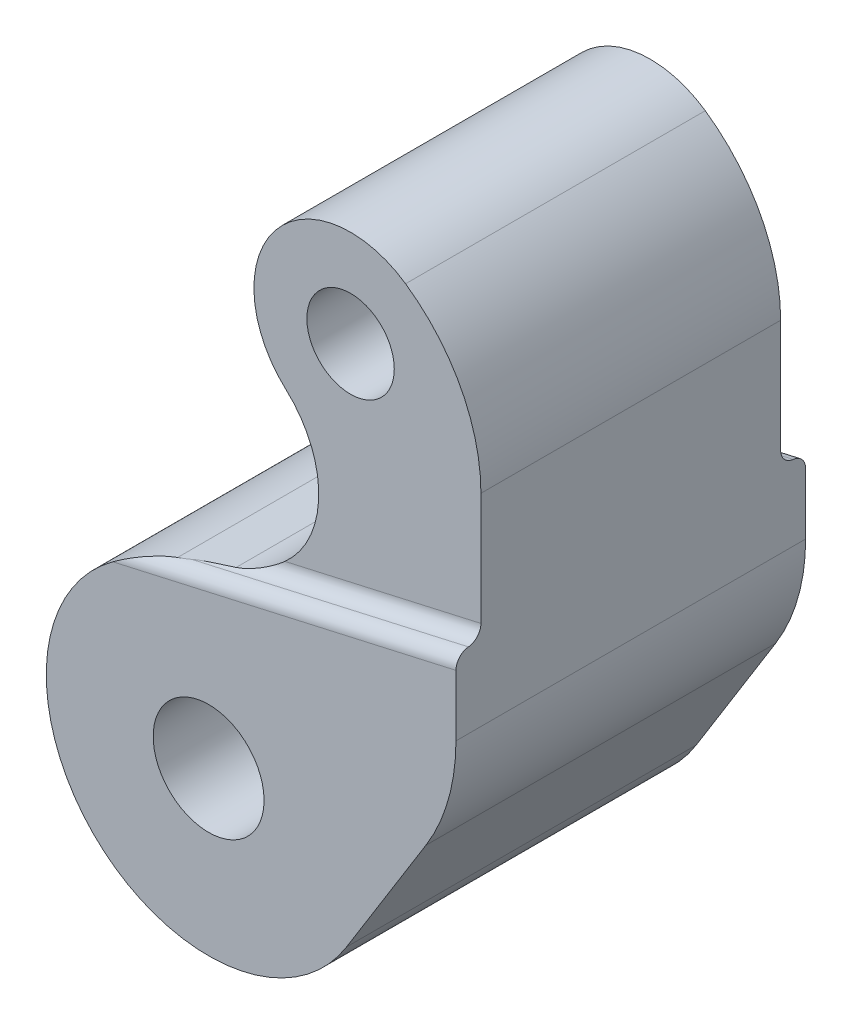
ISO-10303-21;
HEADER;
FILE_DESCRIPTION(('STEP AP214'),'2;1');
FILE_NAME('part.step','',(''),(''),'','','');
FILE_SCHEMA(('AUTOMOTIVE_DESIGN { 1 0 10303 214 1 1 1 1 }'));
ENDSEC;
DATA;
#1=APPLICATION_CONTEXT('core data for automotive mechanical design processes');
#2=APPLICATION_PROTOCOL_DEFINITION('international standard','automotive_design',2000,#1);
#3=PRODUCT_CONTEXT('',#1,'mechanical');
#4=PRODUCT('Part','Part','',(#3));
#5=PRODUCT_RELATED_PRODUCT_CATEGORY('part','',(#4));
#6=PRODUCT_DEFINITION_FORMATION('','',#4);
#7=PRODUCT_DEFINITION_CONTEXT('part definition',#1,'design');
#8=PRODUCT_DEFINITION('design','',#6,#7);
#9=PRODUCT_DEFINITION_SHAPE('','',#8);
#10=(LENGTH_UNIT() NAMED_UNIT(*) SI_UNIT(.MILLI.,.METRE.));
#11=(NAMED_UNIT(*) PLANE_ANGLE_UNIT() SI_UNIT($,.RADIAN.));
#12=(NAMED_UNIT(*) SI_UNIT($,.STERADIAN.) SOLID_ANGLE_UNIT());
#13=UNCERTAINTY_MEASURE_WITH_UNIT(LENGTH_MEASURE(1.E-05),#10,'distance_accuracy_value','');
#14=(GEOMETRIC_REPRESENTATION_CONTEXT(3) GLOBAL_UNCERTAINTY_ASSIGNED_CONTEXT((#13)) GLOBAL_UNIT_ASSIGNED_CONTEXT((#10,
#11,#12)) REPRESENTATION_CONTEXT('',''));
#15=CARTESIAN_POINT('',(0.,0.,0.));
#16=DIRECTION('',(0.,0.,1.));
#17=DIRECTION('',(1.,0.,0.));
#18=AXIS2_PLACEMENT_3D('',#15,#16,#17);
#19=CARTESIAN_POINT('',(-4.54564061344428,8.69992141573822,12.6614987080103));
#20=DIRECTION('',(0.,0.,-1.));
#21=DIRECTION('',(-1.,0.,0.));
#22=AXIS2_PLACEMENT_3D('',#19,#20,#21);
#23=CYLINDRICAL_SURFACE('',#22,7.27131782945737);
#24=CARTESIAN_POINT('',(-4.54564061344428,8.69992141573822,-10.8527131782946));
#25=DIRECTION('',(0.,0.,-1.));
#26=DIRECTION('',(-1.,0.,0.));
#27=AXIS2_PLACEMENT_3D('',#24,#25,#26);
#28=CIRCLE('',#27,7.27131782945737);
#29=CARTESIAN_POINT('',(0.276034989787939,3.25717327218245,-10.8527131782946));
#30=VERTEX_POINT('',#29);
#31=CARTESIAN_POINT('',(0.333314248452021,14.0913834097212,-10.8527131782946));
#32=VERTEX_POINT('',#31);
#33=EDGE_CURVE('E280',#30,#32,#28,.F.);
#34=ORIENTED_EDGE('',*,*,#33,.F.);
#35=CARTESIAN_POINT('',(0.276034989787939,3.25717327218244,-10.8527131782946));
#36=CARTESIAN_POINT('',(0.226197756540657,3.21302130105427,-10.8527225740718));
#37=CARTESIAN_POINT('',(0.175770096713166,3.16957148341845,-10.8542554738337));
#38=CARTESIAN_POINT('',(0.0738533211933617,3.0841620569401,-10.8599818743598));
#39=CARTESIAN_POINT('',(0.0223647207275001,3.04220175049952,-10.8641741118153));
#40=CARTESIAN_POINT('',(-0.133332996916682,2.91882195663878,-10.8801373464317));
#41=CARTESIAN_POINT('',(-0.239016846962875,2.83968869332019,-10.8952986792979));
#42=CARTESIAN_POINT('',(-0.452227146382972,2.68885980213852,-10.931989051614));
#43=CARTESIAN_POINT('',(-0.559708585616153,2.61707720826944,-10.9534281070478));
#44=CARTESIAN_POINT('',(-0.777686744900913,2.47969667993808,-11.000847883523));
#45=CARTESIAN_POINT('',(-0.88818582012181,2.41410376514411,-11.0268322427779));
#46=CARTESIAN_POINT('',(-1.1324798568544,2.27766278163929,-11.0865623083822));
#47=CARTESIAN_POINT('',(-1.26683132092128,2.20805636979421,-11.1208575227865));
#48=CARTESIAN_POINT('',(-1.53938355177362,2.077435817234,-11.1900976355895));
#49=CARTESIAN_POINT('',(-1.677581849714,2.01641631120586,-11.2250421127204));
#50=CARTESIAN_POINT('',(-1.88925878082263,1.93075515925382,-11.2749063533722));
#51=CARTESIAN_POINT('',(-1.96114754813575,1.9029792957367,-11.291223685254));
#52=CARTESIAN_POINT('',(-2.10609478092243,1.84961893985555,-11.3220540335709));
#53=CARTESIAN_POINT('',(-2.17915283890189,1.82403370298654,-11.3365676637741));
#54=CARTESIAN_POINT('',(-2.32669560149712,1.77500994580023,-11.3628354562837));
#55=CARTESIAN_POINT('',(-2.40118329497771,1.75157669489997,-11.3745829497607));
#56=CARTESIAN_POINT('',(-2.55143224926837,1.70697142277684,-11.394185309147));
#57=CARTESIAN_POINT('',(-2.62719499101294,1.68580227615033,-11.4020352715679));
#58=CARTESIAN_POINT('',(-2.70351003772547,1.66581749846585,-11.4073753938027));
#59=B_SPLINE_CURVE_WITH_KNOTS('',3,(#35,#36,#37,#38,#39,#40,#41,#42,#43,#44,#45,#46,#47,#48,#49,
#50,#51,#52,#53,#54,#55,#56,#57,#58),.UNSPECIFIED.,.F.,.F.,(4,2,2,2,2,2,2,2,2,2,2,4),(0.,
0.199684703433552,0.399274618342034,0.797485302502735,1.19024632381154,1.58332317489993,
2.04847354651292,2.5133319777018,2.74961641033204,2.98582021806512,3.22258778451387,
3.45965247845559),.UNSPECIFIED.);
#60=CARTESIAN_POINT('',(-2.70351003772547,1.66581749846585,-11.4073753938027));
#61=VERTEX_POINT('',#60);
#62=EDGE_CURVE('E259',#30,#61,#59,.T.);
#63=ORIENTED_EDGE('',*,*,#62,.T.);
#64=DIRECTION('',(0.,0.,-1.));
#65=VECTOR('',#64,1.);
#66=CARTESIAN_POINT('',(-2.70351003772547,1.66581749846585,12.6614987080103));
#67=LINE('',#66,#65);
#68=CARTESIAN_POINT('',(-2.70351003772547,1.66581749846585,11.4073753938027));
#69=VERTEX_POINT('',#68);
#70=EDGE_CURVE('E64',#69,#61,#67,.T.);
#71=ORIENTED_EDGE('',*,*,#70,.F.);
#72=CARTESIAN_POINT('',(-2.70351003772547,1.66581749846585,11.4073753938027));
#73=CARTESIAN_POINT('',(-2.63592242968063,1.68351656262205,11.4026485295914));
#74=CARTESIAN_POINT('',(-2.56876267366647,1.70214653002607,11.3959471369178));
#75=CARTESIAN_POINT('',(-2.43542600685049,1.74119507649496,11.3793839750118));
#76=CARTESIAN_POINT('',(-2.36924818874445,1.76161186633723,11.3695253415336));
#77=CARTESIAN_POINT('',(-2.17252765096522,1.82537511539845,11.336431939089));
#78=CARTESIAN_POINT('',(-2.04343843021408,1.87132901468455,11.3096462512518));
#79=CARTESIAN_POINT('',(-1.79065323920013,1.9693761892535,11.2523899044842));
#80=CARTESIAN_POINT('',(-1.66690765521051,2.02137690922647,11.2219746500155));
#81=CARTESIAN_POINT('',(-1.42247036146009,2.13213021155744,11.1605744278995));
#82=CARTESIAN_POINT('',(-1.30178156354126,2.19088895662435,11.1295889622446));
#83=CARTESIAN_POINT('',(-1.05414029262874,2.32007119570365,11.0672074853068));
#84=CARTESIAN_POINT('',(-0.927435576223543,2.39104745789854,11.0359686893666));
#85=CARTESIAN_POINT('',(-0.677779221821223,2.54095428624998,10.9783884309391));
#86=CARTESIAN_POINT('',(-0.554824113161502,2.61987718663533,10.9520423171909));
#87=CARTESIAN_POINT('',(-0.372490178520305,2.74488784241905,10.9180245258913));
#88=CARTESIAN_POINT('',(-0.311598392273848,2.78802331252216,10.9075429217016));
#89=CARTESIAN_POINT('',(-0.190945315629366,2.87632465345335,10.8889380736872));
#90=CARTESIAN_POINT('',(-0.131183830326188,2.92149016960749,10.8808144197352));
#91=CARTESIAN_POINT('',(-0.0127109783833322,3.01395000765302,10.867347744451));
#92=CARTESIAN_POINT('',(0.0459967574938729,3.06125023350267,10.8620130225598));
#93=CARTESIAN_POINT('',(0.162070032553974,3.15778858464575,10.8547031387053));
#94=CARTESIAN_POINT('',(0.219434683971381,3.20702793706182,10.8527301402378));
#95=CARTESIAN_POINT('',(0.276034989787784,3.25717327218223,10.8527131782935));
#96=B_SPLINE_CURVE_WITH_KNOTS('',3,(#72,#73,#74,#75,#76,#77,#78,#79,#80,#81,#82,#83,#84,#85,#86,
#87,#88,#89,#90,#91,#92,#93,#94,#95),.UNSPECIFIED.,.F.,.F.,(4,2,2,2,2,2,2,2,2,2,2,4),(0.,
0.209978327021744,0.419748748144656,0.838174921432808,1.25087879402629,1.66396204472108,
2.10933317055686,2.55427870938741,2.78028341463709,3.00624878642265,3.23288282336076,
3.45966265957713),.UNSPECIFIED.);
#97=CARTESIAN_POINT('',(0.27603498978794,3.25717327218245,10.8527131782946));
#98=VERTEX_POINT('',#97);
#99=EDGE_CURVE('E11',#69,#98,#96,.T.);
#100=ORIENTED_EDGE('',*,*,#99,.T.);
#101=CARTESIAN_POINT('',(-4.54564061344428,8.69992141573822,10.8527131782946));
#102=DIRECTION('',(0.,0.,1.));
#103=DIRECTION('',(1.,0.,0.));
#104=AXIS2_PLACEMENT_3D('',#101,#102,#103);
#105=CIRCLE('',#104,7.27131782945737);
#106=CARTESIAN_POINT('',(0.333314248452021,14.0913834097212,10.8527131782946));
#107=VERTEX_POINT('',#106);
#108=EDGE_CURVE('E313',#107,#98,#105,.F.);
#109=ORIENTED_EDGE('',*,*,#108,.F.);
#110=DIRECTION('',(0.,0.,-1.));
#111=VECTOR('',#110,1.);
#112=CARTESIAN_POINT('',(0.333314248452021,14.0913834097212,12.6614987080103));
#113=LINE('',#112,#111);
#114=EDGE_CURVE('E181',#107,#32,#113,.T.);
#115=ORIENTED_EDGE('',*,*,#114,.T.);
#116=EDGE_LOOP('',(#34,#63,#71,#100,#109,#115));
#117=FACE_BOUND('',#116,.T.);
#118=ADVANCED_FACE('F43',(#117),#23,.F.);
#119=CARTESIAN_POINT('',(1.80878552971576,14.6260364888678,12.6614987080103));
#120=DIRECTION('',(0.,0.,-1.));
#121=DIRECTION('',(-1.,0.,0.));
#122=AXIS2_PLACEMENT_3D('',#119,#120,#121);
#123=CYLINDRICAL_SURFACE('',#122,12.6614987080103);
#124=CARTESIAN_POINT('',(1.80878552971576,14.6260364888678,-10.8527131782946));
#125=DIRECTION('',(0.,0.,-1.));
#126=DIRECTION('',(-1.,0.,0.));
#127=AXIS2_PLACEMENT_3D('',#124,#125,#126);
#128=CIRCLE('',#127,12.6614987080103);
#129=CARTESIAN_POINT('',(9.01326833565485,25.0379996578324,-10.8527131782946));
#130=VERTEX_POINT('',#129);
#131=CARTESIAN_POINT('',(14.4702842377261,14.6260364888678,-10.8527131782946));
#132=VERTEX_POINT('',#131);
#133=EDGE_CURVE('E146',#130,#132,#128,.T.);
#134=ORIENTED_EDGE('',*,*,#133,.F.);
#135=DIRECTION('',(0.,0.,-1.));
#136=VECTOR('',#135,1.);
#137=CARTESIAN_POINT('',(9.01326833565485,25.0379996578324,12.6614987080103));
#138=LINE('',#137,#136);
#139=CARTESIAN_POINT('',(9.01326833565485,25.0379996578324,10.8527131782946));
#140=VERTEX_POINT('',#139);
#141=EDGE_CURVE('E174',#140,#130,#138,.T.);
#142=ORIENTED_EDGE('',*,*,#141,.F.);
#143=CARTESIAN_POINT('',(1.80878552971576,14.6260364888678,10.8527131782946));
#144=DIRECTION('',(0.,0.,1.));
#145=DIRECTION('',(1.,0.,0.));
#146=AXIS2_PLACEMENT_3D('',#143,#144,#145);
#147=CIRCLE('',#146,12.6614987080103);
#148=CARTESIAN_POINT('',(14.4702842377261,14.6260364888678,10.8527131782946));
#149=VERTEX_POINT('',#148);
#150=EDGE_CURVE('E171',#149,#140,#147,.T.);
#151=ORIENTED_EDGE('',*,*,#150,.F.);
#152=DIRECTION('',(0.,0.,-1.));
#153=VECTOR('',#152,1.);
#154=CARTESIAN_POINT('',(14.4702842377261,14.6260364888678,12.6614987080103));
#155=LINE('',#154,#153);
#156=EDGE_CURVE('E163',#149,#132,#155,.T.);
#157=ORIENTED_EDGE('',*,*,#156,.T.);
#158=EDGE_LOOP('',(#134,#142,#151,#157));
#159=FACE_BOUND('',#158,.T.);
#160=ADVANCED_FACE('F170',(#159),#123,.T.);
#161=CARTESIAN_POINT('',(5.03021855579995,19.2816714487048,12.6614987080103));
#162=DIRECTION('',(0.,0.,-1.));
#163=DIRECTION('',(-1.,0.,0.));
#164=AXIS2_PLACEMENT_3D('',#161,#162,#163);
#165=CYLINDRICAL_SURFACE('',#164,7.);
#166=CARTESIAN_POINT('',(5.03021855579995,19.2816714487048,-10.8527131782946));
#167=DIRECTION('',(0.,0.,-1.));
#168=DIRECTION('',(-1.,0.,0.));
#169=AXIS2_PLACEMENT_3D('',#166,#167,#168);
#170=CIRCLE('',#169,7.);
#171=EDGE_CURVE('E152',#32,#130,#170,.T.);
#172=ORIENTED_EDGE('',*,*,#171,.F.);
#173=ORIENTED_EDGE('',*,*,#114,.F.);
#174=CARTESIAN_POINT('',(5.03021855579995,19.2816714487048,10.8527131782946));
#175=DIRECTION('',(0.,0.,1.));
#176=DIRECTION('',(1.,0.,0.));
#177=AXIS2_PLACEMENT_3D('',#174,#175,#176);
#178=CIRCLE('',#177,7.);
#179=EDGE_CURVE('E200',#140,#107,#178,.T.);
#180=ORIENTED_EDGE('',*,*,#179,.F.);
#181=ORIENTED_EDGE('',*,*,#141,.T.);
#182=EDGE_LOOP('',(#172,#173,#180,#181));
#183=FACE_BOUND('',#182,.T.);
#184=ADVANCED_FACE('F276',(#183),#165,.T.);
#185=CARTESIAN_POINT('',(5.03021855579995,19.2816714487048,12.6614987080103));
#186=DIRECTION('',(0.,0.,-1.));
#187=DIRECTION('',(-1.,0.,0.));
#188=AXIS2_PLACEMENT_3D('',#185,#186,#187);
#189=CYLINDRICAL_SURFACE('',#188,3.16537467700258);
#190=CARTESIAN_POINT('',(5.03021855579995,19.2816714487048,10.8527131782946));
#191=DIRECTION('',(0.,0.,1.));
#192=DIRECTION('',(1.,0.,0.));
#193=AXIS2_PLACEMENT_3D('',#190,#191,#192);
#194=CIRCLE('',#193,3.16537467700258);
#195=CARTESIAN_POINT('',(8.19559323280254,19.2816714487048,10.8527131782946));
#196=VERTEX_POINT('',#195);
#197=EDGE_CURVE('E197',#196,#196,#194,.T.);
#198=ORIENTED_EDGE('',*,*,#197,.T.);
#199=EDGE_LOOP('',(#198));
#200=FACE_BOUND('',#199,.T.);
#201=CARTESIAN_POINT('',(5.03021855579995,19.2816714487048,-10.8527131782946));
#202=DIRECTION('',(0.,0.,-1.));
#203=DIRECTION('',(-1.,0.,0.));
#204=AXIS2_PLACEMENT_3D('',#201,#202,#203);
#205=CIRCLE('',#204,3.16537467700258);
#206=CARTESIAN_POINT('',(1.86484387879737,19.2816714487048,-10.8527131782946));
#207=VERTEX_POINT('',#206);
#208=EDGE_CURVE('E201',#207,#207,#205,.T.);
#209=ORIENTED_EDGE('',*,*,#208,.T.);
#210=EDGE_LOOP('',(#209));
#211=FACE_BOUND('',#210,.T.);
#212=ADVANCED_FACE('F399',(#200,#211),#189,.F.);
#213=CARTESIAN_POINT('',(-4.54564061344428,8.69992141573822,-12.6614987080103));
#214=DIRECTION('',(0.,0.,-1.));
#215=DIRECTION('',(-1.,0.,0.));
#216=AXIS2_PLACEMENT_3D('',#213,#214,#215);
#217=PLANE('',#216);
#218=CARTESIAN_POINT('',(-3.44154411200398,-10.6810585532448,-12.6614987080103));
#219=DIRECTION('',(0.,0.,1.));
#220=DIRECTION('',(1.,0.,0.));
#221=AXIS2_PLACEMENT_3D('',#218,#219,#220);
#222=CIRCLE('',#221,4.01550387596899);
#223=CARTESIAN_POINT('',(0.573959763965013,-10.6810585532448,-12.6614987080103));
#224=VERTEX_POINT('',#223);
#225=EDGE_CURVE('E317',#224,#224,#222,.T.);
#226=ORIENTED_EDGE('',*,*,#225,.T.);
#227=EDGE_LOOP('',(#226));
#228=FACE_BOUND('',#227,.T.);
#229=CARTESIAN_POINT('',(-3.44154411200398,-10.6810585532448,-12.6614987080103));
#230=DIRECTION('',(0.,0.,1.));
#231=DIRECTION('',(-1.,0.,0.));
#232=AXIS2_PLACEMENT_3D('',#229,#230,#231);
#233=CIRCLE('',#232,11.7571059431525);
#234=CARTESIAN_POINT('',(-10.3852191101125,-1.19343937459135,-12.6614987080103));
#235=VERTEX_POINT('',#234);
#236=CARTESIAN_POINT('',(6.54522573441048,-16.8854093003623,-12.6614987080103));
#237=VERTEX_POINT('',#236);
#238=EDGE_CURVE('E330',#235,#237,#233,.T.);
#239=ORIENTED_EDGE('',*,*,#238,.F.);
#240=DIRECTION('',(-0.975398118163345,-0.220450699893208,0.));
#241=VECTOR('',#240,1.);
#242=CARTESIAN_POINT('',(-2.70209378593431,0.543031430039292,-12.6614987080103));
#243=LINE('',#242,#241);
#244=CARTESIAN_POINT('',(14.4702842377261,4.42417768575999,-12.6614987080103));
#245=VERTEX_POINT('',#244);
#246=EDGE_CURVE('E167',#235,#245,#243,.F.);
#247=ORIENTED_EDGE('',*,*,#246,.T.);
#248=DIRECTION('',(0.,1.,0.));
#249=VECTOR('',#248,1.);
#250=CARTESIAN_POINT('',(14.4702842377261,14.6260364888678,-12.6614987080103));
#251=LINE('',#250,#249);
#252=CARTESIAN_POINT('',(14.4702842377261,0.,-12.6614987080103));
#253=VERTEX_POINT('',#252);
#254=EDGE_CURVE('E336',#253,#245,#251,.T.);
#255=ORIENTED_EDGE('',*,*,#254,.F.);
#256=CARTESIAN_POINT('',(0.,0.,-12.6614987080103));
#257=DIRECTION('',(0.,0.,1.));
#258=DIRECTION('',(-1.,0.,0.));
#259=AXIS2_PLACEMENT_3D('',#256,#257,#258);
#260=CIRCLE('',#259,14.4702842377261);
#261=CARTESIAN_POINT('',(12.2914090417409,-7.63612399645234,-12.6614987080103));
#262=VERTEX_POINT('',#261);
#263=EDGE_CURVE('E351',#262,#253,#260,.T.);
#264=ORIENTED_EDGE('',*,*,#263,.F.);
#265=DIRECTION('',(0.527710711897689,0.849424160563163,0.));
#266=VECTOR('',#265,1.);
#267=CARTESIAN_POINT('',(12.2914090417409,-7.63612399645234,-12.6614987080103));
#268=LINE('',#267,#266);
#269=EDGE_CURVE('E348',#237,#262,#268,.T.);
#270=ORIENTED_EDGE('',*,*,#269,.F.);
#271=EDGE_LOOP('',(#239,#247,#255,#264,#270));
#272=FACE_BOUND('',#271,.T.);
#273=ADVANCED_FACE('F232',(#228,#272),#217,.T.);
#274=CARTESIAN_POINT('',(-3.44154411200398,-10.6810585532448,12.6614987080103));
#275=DIRECTION('',(0.,0.,-1.));
#276=DIRECTION('',(-1.,0.,0.));
#277=AXIS2_PLACEMENT_3D('',#274,#275,#276);
#278=CYLINDRICAL_SURFACE('',#277,11.7571059431525);
#279=CARTESIAN_POINT('',(-3.44154411200398,-10.6810585532448,12.6614987080103));
#280=DIRECTION('',(0.,0.,1.));
#281=DIRECTION('',(-1.,0.,0.));
#282=AXIS2_PLACEMENT_3D('',#279,#280,#281);
#283=CIRCLE('',#282,11.7571059431525);
#284=CARTESIAN_POINT('',(-10.3852191101125,-1.19343937459134,12.6614987080103));
#285=VERTEX_POINT('',#284);
#286=CARTESIAN_POINT('',(6.54522573441048,-16.8854093003623,12.6614987080103));
#287=VERTEX_POINT('',#286);
#288=EDGE_CURVE('E332',#285,#287,#283,.T.);
#289=ORIENTED_EDGE('',*,*,#288,.F.);
#290=CARTESIAN_POINT('',(-10.3852191101125,-1.19343937459134,12.6614987080103));
#291=CARTESIAN_POINT('',(-10.3166598949197,-1.14326146710009,12.6614847749503));
#292=CARTESIAN_POINT('',(-10.247568678724,-1.09383869961419,12.6597827625886));
#293=CARTESIAN_POINT('',(-10.1084458129975,-0.996578470818206,12.6534086051483));
#294=CARTESIAN_POINT('',(-10.0384144853916,-0.948740485352421,12.6487374526225));
#295=CARTESIAN_POINT('',(-9.89758374890607,-0.854754458448012,12.6368384939342));
#296=CARTESIAN_POINT('',(-9.82678549921876,-0.808604231497822,12.6296141334022));
#297=CARTESIAN_POINT('',(-9.68439643575144,-0.717953647649506,12.612930102506));
#298=CARTESIAN_POINT('',(-9.61280554850725,-0.673453445371661,12.6034702232654));
#299=CARTESIAN_POINT('',(-9.39839926604306,-0.543348041841552,12.5723847011991));
#300=CARTESIAN_POINT('',(-9.25450768844662,-0.460176542132678,12.5479189210443));
#301=CARTESIAN_POINT('',(-8.96416078362173,-0.300416807929864,12.4932065477367));
#302=CARTESIAN_POINT('',(-8.81770446871588,-0.223831179874685,12.4629576809833));
#303=CARTESIAN_POINT('',(-8.49096957316831,-0.0616031412596894,12.3913084576695));
#304=CARTESIAN_POINT('',(-8.31013864388605,0.0224877990692826,12.3489056341842));
#305=CARTESIAN_POINT('',(-8.03646402726481,0.141424704082741,12.2826286355989));
#306=CARTESIAN_POINT('',(-7.9448336971918,0.179870704527532,12.2600906482696));
#307=CARTESIAN_POINT('',(-7.76072813955563,0.254390786965875,12.2145093605655));
#308=CARTESIAN_POINT('',(-7.66825286391446,0.290464733018437,12.1914660313306));
#309=CARTESIAN_POINT('',(-7.48129202244054,0.360683624042867,12.1450825614643));
#310=CARTESIAN_POINT('',(-7.38679568807272,0.394799746872605,12.1217422218732));
#311=CARTESIAN_POINT('',(-7.19682203595746,0.460643905037106,12.0757834586961));
#312=CARTESIAN_POINT('',(-7.10134491318356,0.492372404958253,12.053164895162));
#313=CARTESIAN_POINT('',(-6.9091628243356,0.553501289071226,12.009819064418));
#314=CARTESIAN_POINT('',(-6.81245739948963,0.582900771819114,11.9890925290477));
#315=CARTESIAN_POINT('',(-6.6662653659735,0.625279834390655,11.9610577631409));
#316=CARTESIAN_POINT('',(-6.61732743776595,0.639124285766603,11.9522193171236));
#317=CARTESIAN_POINT('',(-6.51903589574784,0.666239964051769,11.9359983475976));
#318=CARTESIAN_POINT('',(-6.46968213885629,0.679510983148491,11.9286163485075));
#319=CARTESIAN_POINT('',(-6.42011345085267,0.692492556772731,11.9221828687085));
#320=B_SPLINE_CURVE_WITH_KNOTS('',3,(#290,#291,#292,#293,#294,#295,#296,#297,#298,#299,#300,
#301,#302,#303,#304,#305,#306,#307,#308,#309,#310,#311,#312,#313,#314,#315,#316,#317,#318,#319),
.UNSPECIFIED.,.F.,.F.,(4,2,2,2,2,2,2,2,2,2,2,2,2,2,4),(0.,0.254834052351754,0.509582961097411,
0.763989383168987,1.01841958518073,1.52207329771144,2.0259254286745,2.63722519157759,
2.94288003812732,3.24855238633027,3.55794512924498,3.86727751365969,4.17672904579742,
4.33156912641717,4.48646485851569),.UNSPECIFIED.);
#321=CARTESIAN_POINT('',(-6.4201134508528,0.692492556772695,11.9221828687078));
#322=VERTEX_POINT('',#321);
#323=EDGE_CURVE('E239',#285,#322,#320,.T.);
#324=ORIENTED_EDGE('',*,*,#323,.T.);
#325=DIRECTION('',(0.,0.,-1.));
#326=VECTOR('',#325,1.);
#327=CARTESIAN_POINT('',(-6.4201134508528,0.692492556772695,12.6614987080103));
#328=LINE('',#327,#326);
#329=CARTESIAN_POINT('',(-6.4201134508528,0.692492556772695,-11.9221828687078));
#330=VERTEX_POINT('',#329);
#331=EDGE_CURVE('E192',#322,#330,#328,.T.);
#332=ORIENTED_EDGE('',*,*,#331,.T.);
#333=CARTESIAN_POINT('',(-6.4201134508528,0.692492556772695,-11.9221828687078));
#334=CARTESIAN_POINT('',(-6.50127151433609,0.671235537942043,-11.9328153663907));
#335=CARTESIAN_POINT('',(-6.5818423763933,0.64920971448834,-11.9458248243824));
#336=CARTESIAN_POINT('',(-6.74190884634964,0.603624444717038,-11.9750591788867));
#337=CARTESIAN_POINT('',(-6.82140516012265,0.580066070831361,-11.9912818428096));
#338=CARTESIAN_POINT('',(-6.97946042478931,0.531412819624307,-12.0254072752013));
#339=CARTESIAN_POINT('',(-7.05802017553858,0.506319385353367,-12.0433084739314));
#340=CARTESIAN_POINT('',(-7.21442425877334,0.454546629407415,-12.0799950183317));
#341=CARTESIAN_POINT('',(-7.29226845735738,0.427867017615897,-12.0987805256129));
#342=CARTESIAN_POINT('',(-7.44659290956178,0.373160723812202,-12.136503545577));
#343=CARTESIAN_POINT('',(-7.52307912062816,0.345148747994731,-12.1554380549062));
#344=CARTESIAN_POINT('',(-7.67545498582983,0.287540814603772,-12.1932683688435));
#345=CARTESIAN_POINT('',(-7.75134467937358,0.257944962693827,-12.2121641759464));
#346=CARTESIAN_POINT('',(-7.9782332236084,0.166732929038489,-12.2683935514038));
#347=CARTESIAN_POINT('',(-8.12839210334381,0.102713334165439,-12.3052540710078));
#348=CARTESIAN_POINT('',(-8.4596761077988,-0.0467808240858296,-12.3839249763824));
#349=CARTESIAN_POINT('',(-8.64025359661806,-0.133858997641649,-12.4250106604148));
#350=CARTESIAN_POINT('',(-8.99781013675463,-0.31776642501198,-12.5001514478885));
#351=CARTESIAN_POINT('',(-9.17479105971646,-0.414590442375728,-12.5342102971684));
#352=CARTESIAN_POINT('',(-9.43828903134303,-0.567746520315984,-12.5779666473571));
#353=CARTESIAN_POINT('',(-9.52630847825874,-0.620454997264351,-12.5913873948896));
#354=CARTESIAN_POINT('',(-9.70122552698329,-0.728346067431774,-12.6151895689186));
#355=CARTESIAN_POINT('',(-9.78812329105279,-0.783528297517056,-12.6255714398323));
#356=CARTESIAN_POINT('',(-9.96086512320618,-0.896445304088087,-12.642777712002));
#357=CARTESIAN_POINT('',(-10.0467067366022,-0.954184964446548,-12.6495949575493));
#358=CARTESIAN_POINT('',(-10.217034428516,-1.07205131066682,-12.6589419854695));
#359=CARTESIAN_POINT('',(-10.3015197639808,-1.13217924624778,-12.6614694920675));
#360=CARTESIAN_POINT('',(-10.3852191101124,-1.19343937459122,-12.6614987080112));
#361=B_SPLINE_CURVE_WITH_KNOTS('',3,(#333,#334,#335,#336,#337,#338,#339,#340,#341,#342,#343,
#344,#345,#346,#347,#348,#349,#350,#351,#352,#353,#354,#355,#356,#357,#358,#359,#360),
.UNSPECIFIED.,.F.,.F.,(4,2,2,2,2,2,2,2,2,2,2,2,2,4),(0.,0.253561640086451,0.506947715409634,
0.760099147607667,1.01329702524534,1.26415791082495,1.51500208178439,2.01688472846346,
2.6304897448316,3.24376681294351,3.55410652727944,3.86440083362862,4.17531566323129,
4.48639538660291),.UNSPECIFIED.);
#362=EDGE_CURVE('E213',#330,#235,#361,.T.);
#363=ORIENTED_EDGE('',*,*,#362,.T.);
#364=ORIENTED_EDGE('',*,*,#238,.T.);
#365=DIRECTION('',(0.,0.,-1.));
#366=VECTOR('',#365,1.);
#367=CARTESIAN_POINT('',(6.54522573441048,-16.8854093003623,12.6614987080103));
#368=LINE('',#367,#366);
#369=EDGE_CURVE('E188',#287,#237,#368,.T.);
#370=ORIENTED_EDGE('',*,*,#369,.F.);
#371=EDGE_LOOP('',(#289,#324,#332,#363,#364,#370));
#372=FACE_BOUND('',#371,.T.);
#373=ADVANCED_FACE('F227',(#372),#278,.T.);
#374=CARTESIAN_POINT('',(14.4702842377261,14.6260364888678,12.6614987080103));
#375=DIRECTION('',(-1.,0.,0.));
#376=DIRECTION('',(0.,-1.,0.));
#377=AXIS2_PLACEMENT_3D('',#374,#375,#376);
#378=PLANE('',#377);
#379=DIRECTION('',(0.,1.,0.));
#380=VECTOR('',#379,1.);
#381=CARTESIAN_POINT('',(14.4702842377261,14.6260364888678,10.8527131782946));
#382=LINE('',#381,#380);
#383=CARTESIAN_POINT('',(14.4702842377261,6.46522967796955,10.8527131782946));
#384=VERTEX_POINT('',#383);
#385=EDGE_CURVE('E318',#384,#149,#382,.T.);
#386=ORIENTED_EDGE('',*,*,#385,.F.);
#387=CARTESIAN_POINT('',(14.4702842377261,6.46522967796955,11.8527131782946));
#388=DIRECTION('',(-1.,0.,0.));
#389=DIRECTION('',(0.,1.,0.));
#390=AXIS2_PLACEMENT_3D('',#387,#388,#389);
#391=ELLIPSE('',#390,1.0252224003497,1.);
#392=CARTESIAN_POINT('',(14.4702842377261,5.44470368186477,11.7571059431525));
#393=VERTEX_POINT('',#392);
#394=EDGE_CURVE('E302',#384,#393,#391,.T.);
#395=ORIENTED_EDGE('',*,*,#394,.T.);
#396=CARTESIAN_POINT('',(14.4702842377261,4.42417768575999,11.6614987080103));
#397=DIRECTION('',(-1.,0.,0.));
#398=DIRECTION('',(0.,1.,0.));
#399=AXIS2_PLACEMENT_3D('',#396,#397,#398);
#400=ELLIPSE('',#399,1.0252224003497,1.);
#401=CARTESIAN_POINT('',(14.4702842377261,4.42417768575999,12.6614987080103));
#402=VERTEX_POINT('',#401);
#403=EDGE_CURVE('E222',#393,#402,#400,.F.);
#404=ORIENTED_EDGE('',*,*,#403,.T.);
#405=DIRECTION('',(0.,1.,0.));
#406=VECTOR('',#405,1.);
#407=CARTESIAN_POINT('',(14.4702842377261,14.6260364888678,12.6614987080103));
#408=LINE('',#407,#406);
#409=CARTESIAN_POINT('',(14.4702842377261,0.,12.6614987080103));
#410=VERTEX_POINT('',#409);
#411=EDGE_CURVE('E342',#410,#402,#408,.T.);
#412=ORIENTED_EDGE('',*,*,#411,.F.);
#413=DIRECTION('',(0.,0.,-1.));
#414=VECTOR('',#413,1.);
#415=CARTESIAN_POINT('',(14.4702842377261,0.,12.6614987080103));
#416=LINE('',#415,#414);
#417=EDGE_CURVE('E173',#410,#253,#416,.T.);
#418=ORIENTED_EDGE('',*,*,#417,.T.);
#419=ORIENTED_EDGE('',*,*,#254,.T.);
#420=CARTESIAN_POINT('',(14.4702842377261,4.42417768575999,-11.6614987080103));
#421=DIRECTION('',(-1.,0.,0.));
#422=DIRECTION('',(0.,-1.,0.));
#423=AXIS2_PLACEMENT_3D('',#420,#421,#422);
#424=ELLIPSE('',#423,1.0252224003497,1.);
#425=CARTESIAN_POINT('',(14.4702842377261,5.44470368186477,-11.7571059431525));
#426=VERTEX_POINT('',#425);
#427=EDGE_CURVE('E206',#245,#426,#424,.F.);
#428=ORIENTED_EDGE('',*,*,#427,.T.);
#429=CARTESIAN_POINT('',(14.4702842377261,6.46522967796955,-11.8527131782946));
#430=DIRECTION('',(-1.,0.,0.));
#431=DIRECTION('',(0.,-1.,0.));
#432=AXIS2_PLACEMENT_3D('',#429,#430,#431);
#433=ELLIPSE('',#432,1.0252224003497,1.);
#434=CARTESIAN_POINT('',(14.4702842377261,6.46522967796955,-10.8527131782946));
#435=VERTEX_POINT('',#434);
#436=EDGE_CURVE('E165',#426,#435,#433,.T.);
#437=ORIENTED_EDGE('',*,*,#436,.T.);
#438=DIRECTION('',(0.,-1.,0.));
#439=VECTOR('',#438,1.);
#440=CARTESIAN_POINT('',(14.4702842377261,14.6260364888678,-10.8527131782946));
#441=LINE('',#440,#439);
#442=EDGE_CURVE('E149',#132,#435,#441,.T.);
#443=ORIENTED_EDGE('',*,*,#442,.F.);
#444=ORIENTED_EDGE('',*,*,#156,.F.);
#445=EDGE_LOOP('',(#386,#395,#404,#412,#418,#419,#428,#437,#443,#444));
#446=FACE_BOUND('',#445,.T.);
#447=ADVANCED_FACE('F162',(#446),#378,.F.);
#448=CARTESIAN_POINT('',(-4.54564061344428,8.69992141573822,12.6614987080103));
#449=DIRECTION('',(0.,0.,-1.));
#450=DIRECTION('',(-1.,0.,0.));
#451=AXIS2_PLACEMENT_3D('',#448,#449,#450);
#452=PLANE('',#451);
#453=ORIENTED_EDGE('',*,*,#411,.T.);
#454=DIRECTION('',(0.975398118163345,0.220450699893208,0.));
#455=VECTOR('',#454,1.);
#456=CARTESIAN_POINT('',(-2.70209378593431,0.543031430039293,12.6614987080103));
#457=LINE('',#456,#455);
#458=EDGE_CURVE('E248',#402,#285,#457,.F.);
#459=ORIENTED_EDGE('',*,*,#458,.T.);
#460=ORIENTED_EDGE('',*,*,#288,.T.);
#461=DIRECTION('',(0.527710711897689,0.849424160563163,0.));
#462=VECTOR('',#461,1.);
#463=CARTESIAN_POINT('',(12.2914090417409,-7.63612399645234,12.6614987080103));
#464=LINE('',#463,#462);
#465=CARTESIAN_POINT('',(12.2914090417409,-7.63612399645234,12.6614987080103));
#466=VERTEX_POINT('',#465);
#467=EDGE_CURVE('E335',#287,#466,#464,.T.);
#468=ORIENTED_EDGE('',*,*,#467,.T.);
#469=CARTESIAN_POINT('',(0.,0.,12.6614987080103));
#470=DIRECTION('',(0.,0.,1.));
#471=DIRECTION('',(-1.,0.,0.));
#472=AXIS2_PLACEMENT_3D('',#469,#470,#471);
#473=CIRCLE('',#472,14.4702842377261);
#474=EDGE_CURVE('E339',#466,#410,#473,.T.);
#475=ORIENTED_EDGE('',*,*,#474,.T.);
#476=EDGE_LOOP('',(#453,#459,#460,#468,#475));
#477=FACE_BOUND('',#476,.T.);
#478=CARTESIAN_POINT('',(-3.44154411200398,-10.6810585532448,12.6614987080103));
#479=DIRECTION('',(0.,0.,1.));
#480=DIRECTION('',(1.,0.,0.));
#481=AXIS2_PLACEMENT_3D('',#478,#479,#480);
#482=CIRCLE('',#481,4.01550387596899);
#483=CARTESIAN_POINT('',(0.573959763965013,-10.6810585532448,12.6614987080103));
#484=VERTEX_POINT('',#483);
#485=EDGE_CURVE('E323',#484,#484,#482,.T.);
#486=ORIENTED_EDGE('',*,*,#485,.F.);
#487=EDGE_LOOP('',(#486));
#488=FACE_BOUND('',#487,.T.);
#489=ADVANCED_FACE('F375',(#477,#488),#452,.F.);
#490=CARTESIAN_POINT('',(-6.4201134508528,0.692492556772695,12.6614987080103));
#491=DIRECTION('',(0.25334205145813,-0.967376764742149,0.));
#492=DIRECTION('',(0.967376764742149,0.25334205145813,0.));
#493=AXIS2_PLACEMENT_3D('',#490,#491,#492);
#494=PLANE('',#493);
#495=ORIENTED_EDGE('',*,*,#331,.F.);
#496=CARTESIAN_POINT('',(-34.0099440030486,-6.53288697086,11.6614987080103));
#497=DIRECTION('',(0.25334205145813,-0.967376764742149,0.));
#498=DIRECTION('',(0.967376764742149,0.25334205145813,0.));
#499=AXIS2_PLACEMENT_3D('',#496,#497,#498);
#500=ELLIPSE('',#499,29.5416825997123,1.);
#501=CARTESIAN_POINT('',(-5.56291830512106,0.916979628030308,11.7571059431525));
#502=VERTEX_POINT('',#501);
#503=EDGE_CURVE('E247',#322,#502,#500,.F.);
#504=ORIENTED_EDGE('',*,*,#503,.T.);
#505=CARTESIAN_POINT('',(22.8841073928065,8.36684622692062,11.8527131782946));
#506=DIRECTION('',(0.25334205145813,-0.967376764742149,0.));
#507=DIRECTION('',(0.967376764742149,0.25334205145813,0.));
#508=AXIS2_PLACEMENT_3D('',#505,#506,#507);
#509=ELLIPSE('',#508,29.5416825997123,1.);
#510=EDGE_CURVE('E59',#502,#69,#509,.T.);
#511=ORIENTED_EDGE('',*,*,#510,.T.);
#512=ORIENTED_EDGE('',*,*,#70,.T.);
#513=CARTESIAN_POINT('',(22.8841073928065,8.36684622692061,-11.8527131782946));
#514=DIRECTION('',(0.25334205145813,-0.967376764742149,0.));
#515=DIRECTION('',(-0.967376764742149,-0.25334205145813,0.));
#516=AXIS2_PLACEMENT_3D('',#513,#514,#515);
#517=ELLIPSE('',#516,29.5416825997123,1.);
#518=CARTESIAN_POINT('',(-5.56291830512106,0.916979628030304,-11.7571059431525));
#519=VERTEX_POINT('',#518);
#520=EDGE_CURVE('E267',#61,#519,#517,.T.);
#521=ORIENTED_EDGE('',*,*,#520,.T.);
#522=CARTESIAN_POINT('',(-34.0099440030486,-6.53288697086001,-11.6614987080103));
#523=DIRECTION('',(0.25334205145813,-0.967376764742149,0.));
#524=DIRECTION('',(-0.967376764742149,-0.25334205145813,0.));
#525=AXIS2_PLACEMENT_3D('',#522,#523,#524);
#526=ELLIPSE('',#525,29.5416825997123,1.);
#527=EDGE_CURVE('E209',#519,#330,#526,.F.);
#528=ORIENTED_EDGE('',*,*,#527,.T.);
#529=EDGE_LOOP('',(#495,#504,#511,#512,#521,#528));
#530=FACE_BOUND('',#529,.T.);
#531=ADVANCED_FACE('F236',(#530),#494,.F.);
#532=CARTESIAN_POINT('',(12.2914090417409,-7.63612399645234,12.6614987080103));
#533=DIRECTION('',(-0.849424160563163,0.527710711897689,0.));
#534=DIRECTION('',(-0.527710711897689,-0.849424160563163,0.));
#535=AXIS2_PLACEMENT_3D('',#532,#533,#534);
#536=PLANE('',#535);
#537=ORIENTED_EDGE('',*,*,#269,.T.);
#538=DIRECTION('',(0.,0.,-1.));
#539=VECTOR('',#538,1.);
#540=CARTESIAN_POINT('',(12.2914090417409,-7.63612399645234,12.6614987080103));
#541=LINE('',#540,#539);
#542=EDGE_CURVE('E179',#466,#262,#541,.T.);
#543=ORIENTED_EDGE('',*,*,#542,.F.);
#544=ORIENTED_EDGE('',*,*,#467,.F.);
#545=ORIENTED_EDGE('',*,*,#369,.T.);
#546=EDGE_LOOP('',(#537,#543,#544,#545));
#547=FACE_BOUND('',#546,.T.);
#548=ADVANCED_FACE('F234',(#547),#536,.F.);
#549=CARTESIAN_POINT('',(0.,0.,12.6614987080103));
#550=DIRECTION('',(0.,0.,-1.));
#551=DIRECTION('',(-1.,0.,0.));
#552=AXIS2_PLACEMENT_3D('',#549,#550,#551);
#553=CYLINDRICAL_SURFACE('',#552,14.4702842377261);
#554=ORIENTED_EDGE('',*,*,#263,.T.);
#555=ORIENTED_EDGE('',*,*,#417,.F.);
#556=ORIENTED_EDGE('',*,*,#474,.F.);
#557=ORIENTED_EDGE('',*,*,#542,.T.);
#558=EDGE_LOOP('',(#554,#555,#556,#557));
#559=FACE_BOUND('',#558,.T.);
#560=ADVANCED_FACE('F385',(#559),#553,.T.);
#561=CARTESIAN_POINT('',(-3.44154411200398,-10.6810585532448,12.6614987080103));
#562=DIRECTION('',(0.,0.,-1.));
#563=DIRECTION('',(-1.,0.,0.));
#564=AXIS2_PLACEMENT_3D('',#561,#562,#563);
#565=CYLINDRICAL_SURFACE('',#564,4.01550387596899);
#566=ORIENTED_EDGE('',*,*,#485,.T.);
#567=EDGE_LOOP('',(#566));
#568=FACE_BOUND('',#567,.T.);
#569=ORIENTED_EDGE('',*,*,#225,.F.);
#570=EDGE_LOOP('',(#569));
#571=FACE_BOUND('',#570,.T.);
#572=ADVANCED_FACE('F387',(#568,#571),#565,.F.);
#573=CARTESIAN_POINT('',(1.80878552971576,14.6260364888678,10.8527131782946));
#574=DIRECTION('',(0.,0.,1.));
#575=DIRECTION('',(1.,0.,0.));
#576=AXIS2_PLACEMENT_3D('',#573,#574,#575);
#577=PLANE('',#576);
#578=ORIENTED_EDGE('',*,*,#197,.F.);
#579=EDGE_LOOP('',(#578));
#580=FACE_BOUND('',#579,.T.);
#581=ORIENTED_EDGE('',*,*,#108,.T.);
#582=DIRECTION('',(-0.975398118163345,-0.220450699893208,0.));
#583=VECTOR('',#582,1.);
#584=CARTESIAN_POINT('',(14.2370963373374,6.41252664841673,10.8527131782946));
#585=LINE('',#584,#583);
#586=EDGE_CURVE('E294',#98,#384,#585,.F.);
#587=ORIENTED_EDGE('',*,*,#586,.T.);
#588=ORIENTED_EDGE('',*,*,#385,.T.);
#589=ORIENTED_EDGE('',*,*,#150,.T.);
#590=ORIENTED_EDGE('',*,*,#179,.T.);
#591=EDGE_LOOP('',(#581,#587,#588,#589,#590));
#592=FACE_BOUND('',#591,.T.);
#593=ADVANCED_FACE('F314',(#580,#592),#577,.T.);
#594=CARTESIAN_POINT('',(1.80878552971576,14.6260364888678,-10.8527131782946));
#595=DIRECTION('',(0.,0.,-1.));
#596=DIRECTION('',(1.,0.,0.));
#597=AXIS2_PLACEMENT_3D('',#594,#595,#596);
#598=PLANE('',#597);
#599=ORIENTED_EDGE('',*,*,#208,.F.);
#600=EDGE_LOOP('',(#599));
#601=FACE_BOUND('',#600,.T.);
#602=ORIENTED_EDGE('',*,*,#442,.T.);
#603=DIRECTION('',(0.975398118163345,0.220450699893208,0.));
#604=VECTOR('',#603,1.);
#605=CARTESIAN_POINT('',(-7.19248414671142,1.56920582571319,-10.8527131782946));
#606=LINE('',#605,#604);
#607=EDGE_CURVE('E287',#435,#30,#606,.F.);
#608=ORIENTED_EDGE('',*,*,#607,.T.);
#609=ORIENTED_EDGE('',*,*,#33,.T.);
#610=ORIENTED_EDGE('',*,*,#171,.T.);
#611=ORIENTED_EDGE('',*,*,#133,.T.);
#612=EDGE_LOOP('',(#602,#608,#609,#610,#611));
#613=FACE_BOUND('',#612,.T.);
#614=ADVANCED_FACE('F148',(#601,#613),#598,.T.);
#615=CARTESIAN_POINT('',(-2.70209378593431,0.543031430039293,-11.6614987080103));
#616=DIRECTION('',(-0.975398118163345,-0.220450699893208,0.));
#617=DIRECTION('',(0.220450699893208,-0.975398118163345,0.));
#618=AXIS2_PLACEMENT_3D('',#615,#616,#617);
#619=CYLINDRICAL_SURFACE('',#618,1.);
#620=ORIENTED_EDGE('',*,*,#527,.F.);
#621=DIRECTION('',(-0.975398118163345,-0.220450699893208,0.));
#622=VECTOR('',#621,1.);
#623=CARTESIAN_POINT('',(-2.92153463118289,1.51396138221147,-11.7571059431525));
#624=LINE('',#623,#622);
#625=EDGE_CURVE('E290',#519,#426,#624,.F.);
#626=ORIENTED_EDGE('',*,*,#625,.T.);
#627=ORIENTED_EDGE('',*,*,#427,.F.);
#628=ORIENTED_EDGE('',*,*,#246,.F.);
#629=ORIENTED_EDGE('',*,*,#362,.F.);
#630=EDGE_LOOP('',(#620,#626,#627,#628,#629));
#631=FACE_BOUND('',#630,.T.);
#632=ADVANCED_FACE('F224',(#631),#619,.T.);
#633=CARTESIAN_POINT('',(-2.58201831982311,0.570169805694623,11.6614987080103));
#634=DIRECTION('',(0.975398118163345,0.220450699893208,0.));
#635=DIRECTION('',(-0.220450699893208,0.975398118163345,0.));
#636=AXIS2_PLACEMENT_3D('',#633,#634,#635);
#637=CYLINDRICAL_SURFACE('',#636,1.);
#638=ORIENTED_EDGE('',*,*,#403,.F.);
#639=DIRECTION('',(0.975398118163345,0.220450699893208,0.));
#640=VECTOR('',#639,1.);
#641=CARTESIAN_POINT('',(-2.80145916507169,1.5410997578668,11.7571059431525));
#642=LINE('',#641,#640);
#643=EDGE_CURVE('E297',#393,#502,#642,.F.);
#644=ORIENTED_EDGE('',*,*,#643,.T.);
#645=ORIENTED_EDGE('',*,*,#503,.F.);
#646=ORIENTED_EDGE('',*,*,#323,.F.);
#647=ORIENTED_EDGE('',*,*,#458,.F.);
#648=EDGE_LOOP('',(#638,#644,#645,#646,#647));
#649=FACE_BOUND('',#648,.T.);
#650=ADVANCED_FACE('F250',(#649),#637,.T.);
#651=CARTESIAN_POINT('',(-3.14097547643147,2.48489133438365,-11.8527131782946));
#652=DIRECTION('',(-0.975398118163345,-0.220450699893208,0.));
#653=DIRECTION('',(0.220450699893208,-0.975398118163345,0.));
#654=AXIS2_PLACEMENT_3D('',#651,#652,#653);
#655=CYLINDRICAL_SURFACE('',#654,1.);
#656=ORIENTED_EDGE('',*,*,#62,.F.);
#657=ORIENTED_EDGE('',*,*,#607,.F.);
#658=ORIENTED_EDGE('',*,*,#436,.F.);
#659=ORIENTED_EDGE('',*,*,#625,.F.);
#660=ORIENTED_EDGE('',*,*,#520,.F.);
#661=EDGE_LOOP('',(#656,#657,#658,#659,#660));
#662=FACE_BOUND('',#661,.T.);
#663=ADVANCED_FACE('F253',(#662),#655,.F.);
#664=CARTESIAN_POINT('',(-3.02090001032026,2.51202971003898,11.8527131782946));
#665=DIRECTION('',(0.975398118163345,0.220450699893208,0.));
#666=DIRECTION('',(-0.220450699893208,0.975398118163345,0.));
#667=AXIS2_PLACEMENT_3D('',#664,#665,#666);
#668=CYLINDRICAL_SURFACE('',#667,1.);
#669=ORIENTED_EDGE('',*,*,#510,.F.);
#670=ORIENTED_EDGE('',*,*,#643,.F.);
#671=ORIENTED_EDGE('',*,*,#394,.F.);
#672=ORIENTED_EDGE('',*,*,#586,.F.);
#673=ORIENTED_EDGE('',*,*,#99,.F.);
#674=EDGE_LOOP('',(#669,#670,#671,#672,#673));
#675=FACE_BOUND('',#674,.T.);
#676=ADVANCED_FACE('F45',(#675),#668,.F.);
#677=CLOSED_SHELL('',(#118,#160,#184,#212,#273,#373,#447,#489,#531,#548,#560,#572,#593,#614,
#632,#650,#663,#676));
#678=MANIFOLD_SOLID_BREP('B2',#677);
#679=ADVANCED_BREP_SHAPE_REPRESENTATION('',(#18,#678),#14);
#680=SHAPE_DEFINITION_REPRESENTATION(#9,#679);
ENDSEC;
END-ISO-10303-21;
